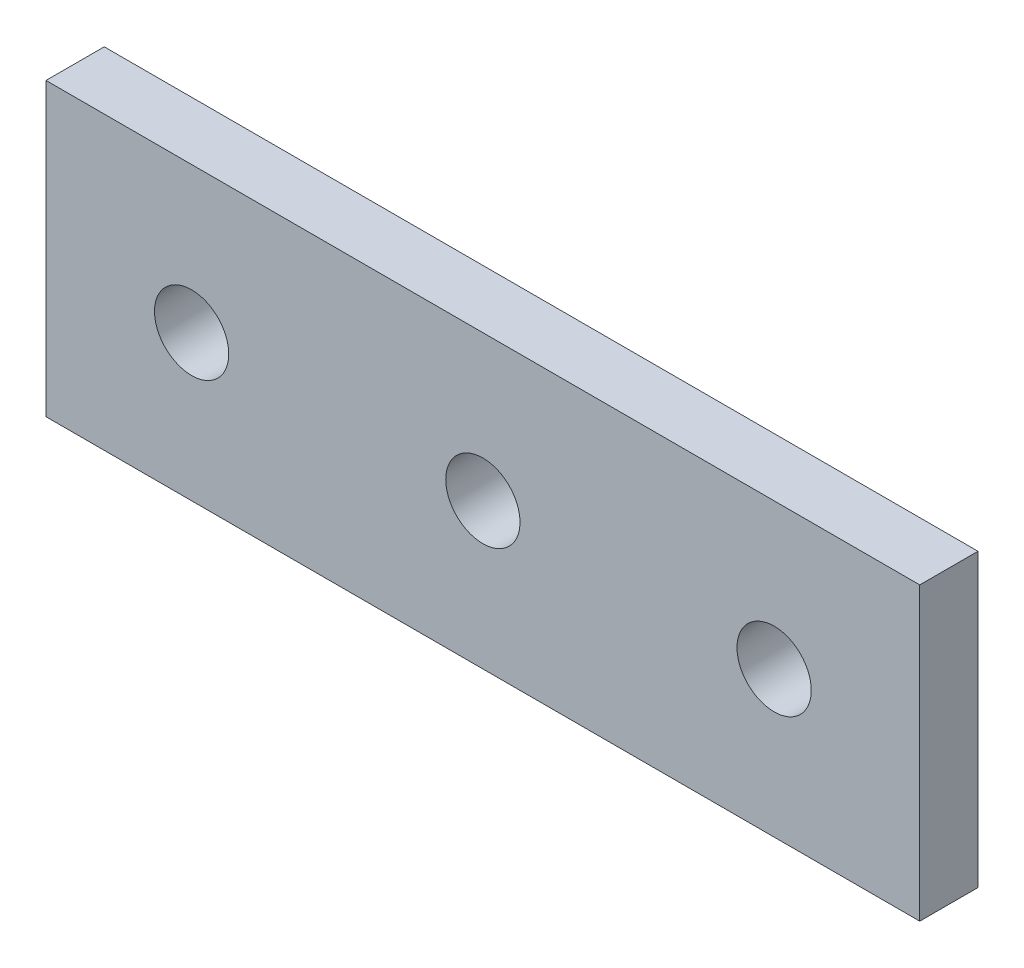
ISO-10303-21;
HEADER;
FILE_DESCRIPTION(('STEP AP214'),'2;1');
FILE_NAME('part.step','',(''),(''),'','','');
FILE_SCHEMA(('AUTOMOTIVE_DESIGN { 1 0 10303 214 1 1 1 1 }'));
ENDSEC;
DATA;
#1=APPLICATION_CONTEXT('core data for automotive mechanical design processes');
#2=APPLICATION_PROTOCOL_DEFINITION('international standard','automotive_design',2000,#1);
#3=PRODUCT_CONTEXT('',#1,'mechanical');
#4=PRODUCT('Part','Part','',(#3));
#5=PRODUCT_RELATED_PRODUCT_CATEGORY('part','',(#4));
#6=PRODUCT_DEFINITION_FORMATION('','',#4);
#7=PRODUCT_DEFINITION_CONTEXT('part definition',#1,'design');
#8=PRODUCT_DEFINITION('design','',#6,#7);
#9=PRODUCT_DEFINITION_SHAPE('','',#8);
#10=(LENGTH_UNIT() NAMED_UNIT(*) SI_UNIT(.MILLI.,.METRE.));
#11=(NAMED_UNIT(*) PLANE_ANGLE_UNIT() SI_UNIT($,.RADIAN.));
#12=(NAMED_UNIT(*) SI_UNIT($,.STERADIAN.) SOLID_ANGLE_UNIT());
#13=UNCERTAINTY_MEASURE_WITH_UNIT(LENGTH_MEASURE(1.E-05),#10,'distance_accuracy_value','');
#14=(GEOMETRIC_REPRESENTATION_CONTEXT(3) GLOBAL_UNCERTAINTY_ASSIGNED_CONTEXT((#13)) GLOBAL_UNIT_ASSIGNED_CONTEXT((#10,
#11,#12)) REPRESENTATION_CONTEXT('',''));
#15=CARTESIAN_POINT('',(0.,0.,0.));
#16=DIRECTION('',(0.,0.,1.));
#17=DIRECTION('',(1.,0.,0.));
#18=AXIS2_PLACEMENT_3D('',#15,#16,#17);
#19=CARTESIAN_POINT('',(30.,10.,0.));
#20=DIRECTION('',(0.,0.,1.));
#21=DIRECTION('',(1.,0.,0.));
#22=AXIS2_PLACEMENT_3D('',#19,#20,#21);
#23=PLANE('',#22);
#24=CARTESIAN_POINT('',(10.,10.,0.));
#25=DIRECTION('',(0.,0.,-1.));
#26=DIRECTION('',(1.,0.,0.));
#27=AXIS2_PLACEMENT_3D('',#24,#25,#26);
#28=CIRCLE('',#27,2.55);
#29=CARTESIAN_POINT('',(7.45,10.,0.));
#30=VERTEX_POINT('',#29);
#31=EDGE_CURVE('E62',#30,#30,#28,.T.);
#32=ORIENTED_EDGE('',*,*,#31,.F.);
#33=EDGE_LOOP('',(#32));
#34=FACE_BOUND('',#33,.T.);
#35=CARTESIAN_POINT('',(30.,10.,0.));
#36=DIRECTION('',(0.,0.,-1.));
#37=DIRECTION('',(1.,0.,0.));
#38=AXIS2_PLACEMENT_3D('',#35,#36,#37);
#39=CIRCLE('',#38,2.55);
#40=CARTESIAN_POINT('',(27.45,10.,0.));
#41=VERTEX_POINT('',#40);
#42=EDGE_CURVE('E98',#41,#41,#39,.T.);
#43=ORIENTED_EDGE('',*,*,#42,.F.);
#44=EDGE_LOOP('',(#43));
#45=FACE_BOUND('',#44,.T.);
#46=CARTESIAN_POINT('',(50.,10.,0.));
#47=DIRECTION('',(0.,0.,-1.));
#48=DIRECTION('',(1.,0.,0.));
#49=AXIS2_PLACEMENT_3D('',#46,#47,#48);
#50=CIRCLE('',#49,2.55);
#51=CARTESIAN_POINT('',(47.45,10.,0.));
#52=VERTEX_POINT('',#51);
#53=EDGE_CURVE('E122',#52,#52,#50,.T.);
#54=ORIENTED_EDGE('',*,*,#53,.F.);
#55=EDGE_LOOP('',(#54));
#56=FACE_BOUND('',#55,.T.);
#57=DIRECTION('',(0.,-1.,0.));
#58=VECTOR('',#57,1.);
#59=CARTESIAN_POINT('',(0.,20.,0.));
#60=LINE('',#59,#58);
#61=CARTESIAN_POINT('',(0.,20.,0.));
#62=VERTEX_POINT('',#61);
#63=CARTESIAN_POINT('',(0.,0.,0.));
#64=VERTEX_POINT('',#63);
#65=EDGE_CURVE('E27',#62,#64,#60,.T.);
#66=ORIENTED_EDGE('',*,*,#65,.F.);
#67=DIRECTION('',(-1.,0.,0.));
#68=VECTOR('',#67,1.);
#69=CARTESIAN_POINT('',(60.,20.,0.));
#70=LINE('',#69,#68);
#71=CARTESIAN_POINT('',(60.,20.,0.));
#72=VERTEX_POINT('',#71);
#73=EDGE_CURVE('E125',#72,#62,#70,.T.);
#74=ORIENTED_EDGE('',*,*,#73,.F.);
#75=DIRECTION('',(0.,1.,0.));
#76=VECTOR('',#75,1.);
#77=CARTESIAN_POINT('',(60.,0.,0.));
#78=LINE('',#77,#76);
#79=CARTESIAN_POINT('',(60.,0.,0.));
#80=VERTEX_POINT('',#79);
#81=EDGE_CURVE('E131',#80,#72,#78,.T.);
#82=ORIENTED_EDGE('',*,*,#81,.F.);
#83=DIRECTION('',(1.,0.,0.));
#84=VECTOR('',#83,1.);
#85=CARTESIAN_POINT('',(0.,0.,0.));
#86=LINE('',#85,#84);
#87=EDGE_CURVE('E152',#64,#80,#86,.T.);
#88=ORIENTED_EDGE('',*,*,#87,.F.);
#89=EDGE_LOOP('',(#66,#74,#82,#88));
#90=FACE_BOUND('',#89,.T.);
#91=ADVANCED_FACE('F16',(#34,#45,#56,#90),#23,.F.);
#92=CARTESIAN_POINT('',(30.,10.,4.));
#93=DIRECTION('',(0.,0.,1.));
#94=DIRECTION('',(1.,0.,0.));
#95=AXIS2_PLACEMENT_3D('',#92,#93,#94);
#96=PLANE('',#95);
#97=CARTESIAN_POINT('',(10.,10.,4.));
#98=DIRECTION('',(0.,0.,-1.));
#99=DIRECTION('',(1.,0.,0.));
#100=AXIS2_PLACEMENT_3D('',#97,#98,#99);
#101=CIRCLE('',#100,2.55);
#102=CARTESIAN_POINT('',(7.45,10.,4.));
#103=VERTEX_POINT('',#102);
#104=EDGE_CURVE('E119',#103,#103,#101,.T.);
#105=ORIENTED_EDGE('',*,*,#104,.T.);
#106=EDGE_LOOP('',(#105));
#107=FACE_BOUND('',#106,.T.);
#108=CARTESIAN_POINT('',(30.,10.,4.));
#109=DIRECTION('',(0.,0.,-1.));
#110=DIRECTION('',(1.,0.,0.));
#111=AXIS2_PLACEMENT_3D('',#108,#109,#110);
#112=CIRCLE('',#111,2.55);
#113=CARTESIAN_POINT('',(27.45,10.,4.));
#114=VERTEX_POINT('',#113);
#115=EDGE_CURVE('E20',#114,#114,#112,.T.);
#116=ORIENTED_EDGE('',*,*,#115,.T.);
#117=EDGE_LOOP('',(#116));
#118=FACE_BOUND('',#117,.T.);
#119=CARTESIAN_POINT('',(50.,10.,4.));
#120=DIRECTION('',(0.,0.,-1.));
#121=DIRECTION('',(1.,0.,0.));
#122=AXIS2_PLACEMENT_3D('',#119,#120,#121);
#123=CIRCLE('',#122,2.55);
#124=CARTESIAN_POINT('',(47.45,10.,4.));
#125=VERTEX_POINT('',#124);
#126=EDGE_CURVE('E105',#125,#125,#123,.T.);
#127=ORIENTED_EDGE('',*,*,#126,.T.);
#128=EDGE_LOOP('',(#127));
#129=FACE_BOUND('',#128,.T.);
#130=DIRECTION('',(0.,-1.,0.));
#131=VECTOR('',#130,1.);
#132=CARTESIAN_POINT('',(0.,20.,4.));
#133=LINE('',#132,#131);
#134=CARTESIAN_POINT('',(0.,20.,4.));
#135=VERTEX_POINT('',#134);
#136=CARTESIAN_POINT('',(0.,0.,4.));
#137=VERTEX_POINT('',#136);
#138=EDGE_CURVE('E11',#135,#137,#133,.T.);
#139=ORIENTED_EDGE('',*,*,#138,.T.);
#140=DIRECTION('',(1.,0.,0.));
#141=VECTOR('',#140,1.);
#142=CARTESIAN_POINT('',(0.,0.,4.));
#143=LINE('',#142,#141);
#144=CARTESIAN_POINT('',(60.,0.,4.));
#145=VERTEX_POINT('',#144);
#146=EDGE_CURVE('E149',#137,#145,#143,.T.);
#147=ORIENTED_EDGE('',*,*,#146,.T.);
#148=DIRECTION('',(0.,1.,0.));
#149=VECTOR('',#148,1.);
#150=CARTESIAN_POINT('',(60.,0.,4.));
#151=LINE('',#150,#149);
#152=CARTESIAN_POINT('',(60.,20.,4.));
#153=VERTEX_POINT('',#152);
#154=EDGE_CURVE('E167',#145,#153,#151,.T.);
#155=ORIENTED_EDGE('',*,*,#154,.T.);
#156=DIRECTION('',(-1.,0.,0.));
#157=VECTOR('',#156,1.);
#158=CARTESIAN_POINT('',(60.,20.,4.));
#159=LINE('',#158,#157);
#160=EDGE_CURVE('E132',#153,#135,#159,.T.);
#161=ORIENTED_EDGE('',*,*,#160,.T.);
#162=EDGE_LOOP('',(#139,#147,#155,#161));
#163=FACE_BOUND('',#162,.T.);
#164=ADVANCED_FACE('F178',(#107,#118,#129,#163),#96,.T.);
#165=CARTESIAN_POINT('',(0.,20.,0.));
#166=DIRECTION('',(-1.,0.,0.));
#167=DIRECTION('',(0.,0.,1.));
#168=AXIS2_PLACEMENT_3D('',#165,#166,#167);
#169=PLANE('',#168);
#170=ORIENTED_EDGE('',*,*,#65,.T.);
#171=DIRECTION('',(0.,0.,1.));
#172=VECTOR('',#171,1.);
#173=CARTESIAN_POINT('',(0.,0.,0.));
#174=LINE('',#173,#172);
#175=EDGE_CURVE('E151',#64,#137,#174,.T.);
#176=ORIENTED_EDGE('',*,*,#175,.T.);
#177=ORIENTED_EDGE('',*,*,#138,.F.);
#178=DIRECTION('',(0.,0.,1.));
#179=VECTOR('',#178,1.);
#180=CARTESIAN_POINT('',(0.,20.,0.));
#181=LINE('',#180,#179);
#182=EDGE_CURVE('E133',#62,#135,#181,.T.);
#183=ORIENTED_EDGE('',*,*,#182,.F.);
#184=EDGE_LOOP('',(#170,#176,#177,#183));
#185=FACE_BOUND('',#184,.T.);
#186=ADVANCED_FACE('F199',(#185),#169,.T.);
#187=CARTESIAN_POINT('',(0.,0.,0.));
#188=DIRECTION('',(0.,-1.,0.));
#189=DIRECTION('',(0.,0.,-1.));
#190=AXIS2_PLACEMENT_3D('',#187,#188,#189);
#191=PLANE('',#190);
#192=ORIENTED_EDGE('',*,*,#87,.T.);
#193=DIRECTION('',(0.,0.,1.));
#194=VECTOR('',#193,1.);
#195=CARTESIAN_POINT('',(60.,0.,0.));
#196=LINE('',#195,#194);
#197=EDGE_CURVE('E159',#80,#145,#196,.T.);
#198=ORIENTED_EDGE('',*,*,#197,.T.);
#199=ORIENTED_EDGE('',*,*,#146,.F.);
#200=ORIENTED_EDGE('',*,*,#175,.F.);
#201=EDGE_LOOP('',(#192,#198,#199,#200));
#202=FACE_BOUND('',#201,.T.);
#203=ADVANCED_FACE('F192',(#202),#191,.T.);
#204=CARTESIAN_POINT('',(60.,0.,0.));
#205=DIRECTION('',(1.,0.,0.));
#206=DIRECTION('',(0.,1.,0.));
#207=AXIS2_PLACEMENT_3D('',#204,#205,#206);
#208=PLANE('',#207);
#209=ORIENTED_EDGE('',*,*,#81,.T.);
#210=DIRECTION('',(0.,0.,1.));
#211=VECTOR('',#210,1.);
#212=CARTESIAN_POINT('',(60.,20.,0.));
#213=LINE('',#212,#211);
#214=EDGE_CURVE('E128',#72,#153,#213,.T.);
#215=ORIENTED_EDGE('',*,*,#214,.T.);
#216=ORIENTED_EDGE('',*,*,#154,.F.);
#217=ORIENTED_EDGE('',*,*,#197,.F.);
#218=EDGE_LOOP('',(#209,#215,#216,#217));
#219=FACE_BOUND('',#218,.T.);
#220=ADVANCED_FACE('F18',(#219),#208,.T.);
#221=CARTESIAN_POINT('',(60.,20.,0.));
#222=DIRECTION('',(0.,1.,0.));
#223=DIRECTION('',(1.,0.,0.));
#224=AXIS2_PLACEMENT_3D('',#221,#222,#223);
#225=PLANE('',#224);
#226=ORIENTED_EDGE('',*,*,#73,.T.);
#227=ORIENTED_EDGE('',*,*,#182,.T.);
#228=ORIENTED_EDGE('',*,*,#160,.F.);
#229=ORIENTED_EDGE('',*,*,#214,.F.);
#230=EDGE_LOOP('',(#226,#227,#228,#229));
#231=FACE_BOUND('',#230,.T.);
#232=ADVANCED_FACE('F181',(#231),#225,.T.);
#233=CARTESIAN_POINT('',(50.,10.,0.));
#234=DIRECTION('',(0.,0.,1.));
#235=DIRECTION('',(1.,0.,0.));
#236=AXIS2_PLACEMENT_3D('',#233,#234,#235);
#237=CYLINDRICAL_SURFACE('',#236,2.55);
#238=ORIENTED_EDGE('',*,*,#126,.F.);
#239=DIRECTION('',(0.,0.,-1.));
#240=VECTOR('',#239,1.);
#241=CARTESIAN_POINT('',(47.45,10.,0.));
#242=LINE('',#241,#240);
#243=EDGE_CURVE('E112',#125,#52,#242,.T.);
#244=ORIENTED_EDGE('',*,*,#243,.T.);
#245=ORIENTED_EDGE('',*,*,#53,.T.);
#246=ORIENTED_EDGE('',*,*,#243,.F.);
#247=EDGE_LOOP('',(#238,#244,#245,#246));
#248=FACE_BOUND('',#247,.T.);
#249=ADVANCED_FACE('F183',(#248),#237,.F.);
#250=CARTESIAN_POINT('',(30.,10.,0.));
#251=DIRECTION('',(0.,0.,1.));
#252=DIRECTION('',(1.,0.,0.));
#253=AXIS2_PLACEMENT_3D('',#250,#251,#252);
#254=CYLINDRICAL_SURFACE('',#253,2.55);
#255=ORIENTED_EDGE('',*,*,#115,.F.);
#256=DIRECTION('',(0.,0.,-1.));
#257=VECTOR('',#256,1.);
#258=CARTESIAN_POINT('',(27.45,10.,0.));
#259=LINE('',#258,#257);
#260=EDGE_CURVE('E101',#114,#41,#259,.T.);
#261=ORIENTED_EDGE('',*,*,#260,.T.);
#262=ORIENTED_EDGE('',*,*,#42,.T.);
#263=ORIENTED_EDGE('',*,*,#260,.F.);
#264=EDGE_LOOP('',(#255,#261,#262,#263));
#265=FACE_BOUND('',#264,.T.);
#266=ADVANCED_FACE('F100',(#265),#254,.F.);
#267=CARTESIAN_POINT('',(10.,10.,0.));
#268=DIRECTION('',(0.,0.,1.));
#269=DIRECTION('',(1.,0.,0.));
#270=AXIS2_PLACEMENT_3D('',#267,#268,#269);
#271=CYLINDRICAL_SURFACE('',#270,2.55);
#272=ORIENTED_EDGE('',*,*,#104,.F.);
#273=DIRECTION('',(0.,0.,-1.));
#274=VECTOR('',#273,1.);
#275=CARTESIAN_POINT('',(7.45,10.,0.));
#276=LINE('',#275,#274);
#277=EDGE_CURVE('E73',#103,#30,#276,.T.);
#278=ORIENTED_EDGE('',*,*,#277,.T.);
#279=ORIENTED_EDGE('',*,*,#31,.T.);
#280=ORIENTED_EDGE('',*,*,#277,.F.);
#281=EDGE_LOOP('',(#272,#278,#279,#280));
#282=FACE_BOUND('',#281,.T.);
#283=ADVANCED_FACE('F266',(#282),#271,.F.);
#284=CLOSED_SHELL('',(#91,#164,#186,#203,#220,#232,#249,#266,#283));
#285=MANIFOLD_SOLID_BREP('B1',#284);
#286=ADVANCED_BREP_SHAPE_REPRESENTATION('',(#18,#285),#14);
#287=SHAPE_DEFINITION_REPRESENTATION(#9,#286);
ENDSEC;
END-ISO-10303-21;
